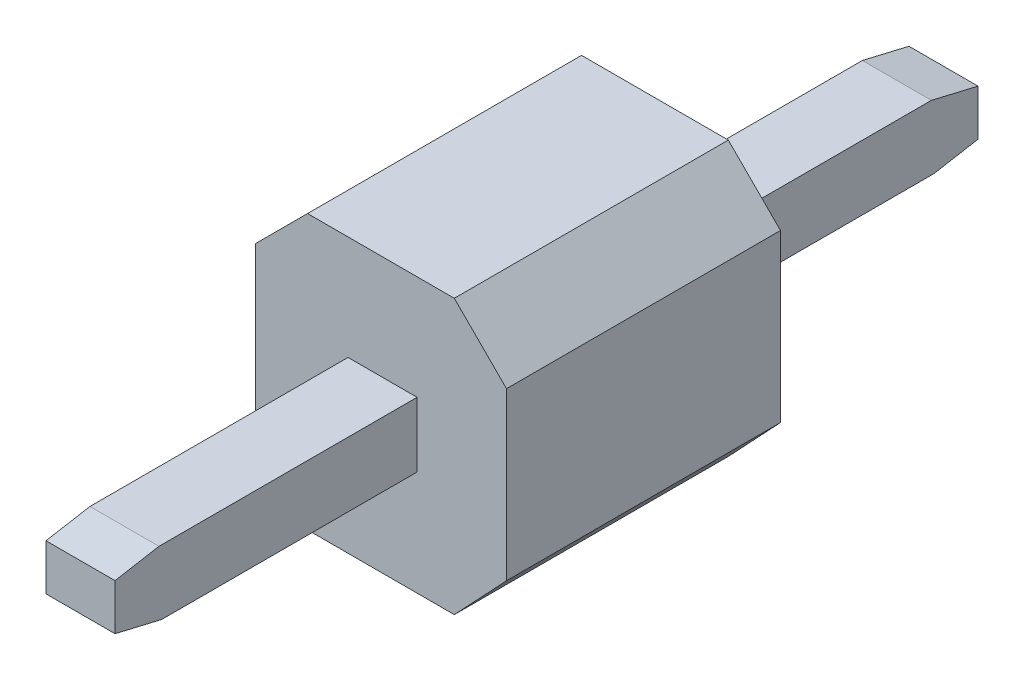
ISO-10303-21;
HEADER;
FILE_DESCRIPTION(('STEP AP214'),'2;1');
FILE_NAME('part.step','',(''),(''),'','','');
FILE_SCHEMA(('AUTOMOTIVE_DESIGN { 1 0 10303 214 1 1 1 1 }'));
ENDSEC;
DATA;
#1=APPLICATION_CONTEXT('core data for automotive mechanical design processes');
#2=APPLICATION_PROTOCOL_DEFINITION('international standard','automotive_design',2000,#1);
#3=PRODUCT_CONTEXT('',#1,'mechanical');
#4=PRODUCT('Part','Part','',(#3));
#5=PRODUCT_RELATED_PRODUCT_CATEGORY('part','',(#4));
#6=PRODUCT_DEFINITION_FORMATION('','',#4);
#7=PRODUCT_DEFINITION_CONTEXT('part definition',#1,'design');
#8=PRODUCT_DEFINITION('design','',#6,#7);
#9=PRODUCT_DEFINITION_SHAPE('','',#8);
#10=(LENGTH_UNIT() NAMED_UNIT(*) SI_UNIT(.MILLI.,.METRE.));
#11=(NAMED_UNIT(*) PLANE_ANGLE_UNIT() SI_UNIT($,.RADIAN.));
#12=(NAMED_UNIT(*) SI_UNIT($,.STERADIAN.) SOLID_ANGLE_UNIT());
#13=UNCERTAINTY_MEASURE_WITH_UNIT(LENGTH_MEASURE(1.E-05),#10,'distance_accuracy_value','');
#14=(GEOMETRIC_REPRESENTATION_CONTEXT(3) GLOBAL_UNCERTAINTY_ASSIGNED_CONTEXT((#13)) GLOBAL_UNIT_ASSIGNED_CONTEXT((#10,
#11,#12)) REPRESENTATION_CONTEXT('',''));
#15=CARTESIAN_POINT('',(0.,0.,0.));
#16=DIRECTION('',(0.,0.,1.));
#17=DIRECTION('',(1.,0.,0.));
#18=AXIS2_PLACEMENT_3D('',#15,#16,#17);
#19=CARTESIAN_POINT('',(0.957607448466312,1.186765593588,-6.2));
#20=DIRECTION('',(0.,-0.984784936297395,-0.17377752801135));
#21=DIRECTION('',(-1.,0.,0.));
#22=AXIS2_PLACEMENT_3D('',#19,#20,#21);
#23=PLANE('',#22);
#24=DIRECTION('',(0.,0.17377752801135,-0.984784936297395));
#25=VECTOR('',#24,1.);
#26=CARTESIAN_POINT('',(0.940000448466309,0.0302182210716873,0.354072));
#27=LINE('',#26,#25);
#28=CARTESIAN_POINT('',(0.940000448466309,1.11489990927489,-5.79274225984129));
#29=VERTEX_POINT('',#28);
#30=CARTESIAN_POINT('',(0.940000448466309,1.186765593588,-6.2));
#31=VERTEX_POINT('',#30);
#32=EDGE_CURVE('E162',#29,#31,#27,.T.);
#33=ORIENTED_EDGE('',*,*,#32,.T.);
#34=DIRECTION('',(1.,0.,0.));
#35=VECTOR('',#34,1.);
#36=CARTESIAN_POINT('',(1.2448931627479,1.186765593588,-6.2));
#37=LINE('',#36,#35);
#38=CARTESIAN_POINT('',(1.58000016274341,1.186765593588,-6.2));
#39=VERTEX_POINT('',#38);
#40=EDGE_CURVE('E12',#31,#39,#37,.T.);
#41=ORIENTED_EDGE('',*,*,#40,.T.);
#42=DIRECTION('',(0.,-0.17377752801135,0.984784936297395));
#43=VECTOR('',#42,1.);
#44=CARTESIAN_POINT('',(1.58000016274341,0.0302182210716873,0.354072));
#45=LINE('',#44,#43);
#46=CARTESIAN_POINT('',(1.58000016274341,1.11489990927489,-5.79274225984129));
#47=VERTEX_POINT('',#46);
#48=EDGE_CURVE('E201',#39,#47,#45,.T.);
#49=ORIENTED_EDGE('',*,*,#48,.T.);
#50=DIRECTION('',(-1.,0.,0.));
#51=VECTOR('',#50,1.);
#52=CARTESIAN_POINT('',(1.2448931627479,1.11489990927489,-5.79274225984129));
#53=LINE('',#52,#51);
#54=EDGE_CURVE('E196',#47,#29,#53,.T.);
#55=ORIENTED_EDGE('',*,*,#54,.T.);
#56=EDGE_LOOP('',(#33,#41,#49,#55));
#57=FACE_BOUND('',#56,.T.);
#58=ADVANCED_FACE('F54',(#57),#23,.T.);
#59=CARTESIAN_POINT('',(1.2448931627479,2.2034713378129,-6.2));
#60=DIRECTION('',(0.,0.,1.));
#61=DIRECTION('',(0.,-1.,0.));
#62=AXIS2_PLACEMENT_3D('',#59,#60,#61);
#63=PLANE('',#62);
#64=DIRECTION('',(-1.,0.,0.));
#65=VECTOR('',#64,1.);
#66=CARTESIAN_POINT('',(1.2448931627479,1.61323393573551,-6.2));
#67=LINE('',#66,#65);
#68=CARTESIAN_POINT('',(1.58000016274341,1.61323393573551,-6.2));
#69=VERTEX_POINT('',#68);
#70=CARTESIAN_POINT('',(0.940000448466309,1.61323393573551,-6.2));
#71=VERTEX_POINT('',#70);
#72=EDGE_CURVE('E65',#69,#71,#67,.T.);
#73=ORIENTED_EDGE('',*,*,#72,.F.);
#74=DIRECTION('',(0.,-1.,0.));
#75=VECTOR('',#74,1.);
#76=CARTESIAN_POINT('',(1.58000016274341,-26.473278661799,-6.2));
#77=LINE('',#76,#75);
#78=EDGE_CURVE('E198',#69,#39,#77,.T.);
#79=ORIENTED_EDGE('',*,*,#78,.T.);
#80=ORIENTED_EDGE('',*,*,#40,.F.);
#81=DIRECTION('',(0.,1.,0.));
#82=VECTOR('',#81,1.);
#83=CARTESIAN_POINT('',(0.940000448466309,-26.473278661799,-6.2));
#84=LINE('',#83,#82);
#85=EDGE_CURVE('E58',#31,#71,#84,.T.);
#86=ORIENTED_EDGE('',*,*,#85,.T.);
#87=EDGE_LOOP('',(#73,#79,#80,#86));
#88=FACE_BOUND('',#87,.T.);
#89=ADVANCED_FACE('F309',(#88),#63,.F.);
#90=CARTESIAN_POINT('',(0.957607448466312,1.71489990926631,-5.76794212488841));
#91=DIRECTION('',(0.,0.973414507556786,-0.229050641732304));
#92=DIRECTION('',(0.,0.229050641732304,0.973414507556786));
#93=AXIS2_PLACEMENT_3D('',#90,#91,#92);
#94=PLANE('',#93);
#95=DIRECTION('',(0.,0.229050641732304,0.973414507556786));
#96=VECTOR('',#95,1.);
#97=CARTESIAN_POINT('',(0.940000448466309,3.155448876961,0.354072));
#98=LINE('',#97,#96);
#99=CARTESIAN_POINT('',(0.940000448466309,1.71489990926631,-5.76794212488841));
#100=VERTEX_POINT('',#99);
#101=EDGE_CURVE('E210',#71,#100,#98,.T.);
#102=ORIENTED_EDGE('',*,*,#101,.T.);
#103=DIRECTION('',(1.,0.,0.));
#104=VECTOR('',#103,1.);
#105=CARTESIAN_POINT('',(1.2448931627479,1.71489990926631,-5.76794212488841));
#106=LINE('',#105,#104);
#107=CARTESIAN_POINT('',(1.58000016274341,1.71489990926631,-5.76794212488841));
#108=VERTEX_POINT('',#107);
#109=EDGE_CURVE('E204',#100,#108,#106,.T.);
#110=ORIENTED_EDGE('',*,*,#109,.T.);
#111=DIRECTION('',(0.,-0.229050641732304,-0.973414507556786));
#112=VECTOR('',#111,1.);
#113=CARTESIAN_POINT('',(1.58000016274341,3.155448876961,0.354072));
#114=LINE('',#113,#112);
#115=EDGE_CURVE('E159',#108,#69,#114,.T.);
#116=ORIENTED_EDGE('',*,*,#115,.T.);
#117=ORIENTED_EDGE('',*,*,#72,.T.);
#118=EDGE_LOOP('',(#102,#110,#116,#117));
#119=FACE_BOUND('',#118,.T.);
#120=ADVANCED_FACE('F299',(#119),#94,.T.);
#121=CARTESIAN_POINT('',(1.58000016274341,1.7196499092663,-0.4095));
#122=DIRECTION('',(-1.,0.,0.));
#123=DIRECTION('',(0.,0.,-1.));
#124=AXIS2_PLACEMENT_3D('',#121,#122,#123);
#125=PLANE('',#124);
#126=DIRECTION('',(0.,0.,-1.));
#127=VECTOR('',#126,1.);
#128=CARTESIAN_POINT('',(1.58000016274341,1.11489990927489,-0.4095));
#129=LINE('',#128,#127);
#130=CARTESIAN_POINT('',(1.58000016274341,1.11489988271578,1.36794212488841));
#131=VERTEX_POINT('',#130);
#132=EDGE_CURVE('E123',#131,#47,#129,.T.);
#133=ORIENTED_EDGE('',*,*,#132,.T.);
#134=ORIENTED_EDGE('',*,*,#48,.F.);
#135=ORIENTED_EDGE('',*,*,#78,.F.);
#136=ORIENTED_EDGE('',*,*,#115,.F.);
#137=DIRECTION('',(0.,0.,-1.));
#138=VECTOR('',#137,1.);
#139=CARTESIAN_POINT('',(1.58000016274341,1.71489990926631,-0.4095));
#140=LINE('',#139,#138);
#141=CARTESIAN_POINT('',(1.58000016274341,1.7148998827072,1.39274225984129));
#142=VERTEX_POINT('',#141);
#143=EDGE_CURVE('E104',#142,#108,#140,.T.);
#144=ORIENTED_EDGE('',*,*,#143,.F.);
#145=DIRECTION('',(0.,0.173777528011357,-0.984784936297394));
#146=VECTOR('',#145,1.);
#147=CARTESIAN_POINT('',(1.58000016274341,2.79958157091045,-4.75407199999999));
#148=LINE('',#147,#146);
#149=CARTESIAN_POINT('',(1.58000016274341,1.64303419839408,1.8));
#150=VERTEX_POINT('',#149);
#151=EDGE_CURVE('E157',#150,#142,#148,.T.);
#152=ORIENTED_EDGE('',*,*,#151,.F.);
#153=DIRECTION('',(0.,1.,0.));
#154=VECTOR('',#153,1.);
#155=CARTESIAN_POINT('',(1.58000016274341,29.3030784537811,1.80000000000019));
#156=LINE('',#155,#154);
#157=CARTESIAN_POINT('',(1.58000016274341,1.21656585624658,1.8));
#158=VERTEX_POINT('',#157);
#159=EDGE_CURVE('E172',#158,#150,#156,.T.);
#160=ORIENTED_EDGE('',*,*,#159,.F.);
#161=DIRECTION('',(0.,0.229050641732297,0.973414507556787));
#162=VECTOR('',#161,1.);
#163=CARTESIAN_POINT('',(1.58000016274341,-0.325649084978862,-4.75407200000001));
#164=LINE('',#163,#162);
#165=EDGE_CURVE('E388',#131,#158,#164,.T.);
#166=ORIENTED_EDGE('',*,*,#165,.F.);
#167=EDGE_LOOP('',(#133,#134,#135,#136,#144,#152,#160,#166));
#168=FACE_BOUND('',#167,.T.);
#169=ADVANCED_FACE('F56',(#168),#125,.F.);
#170=CARTESIAN_POINT('',(0.940000448466309,1.11489990927489,-0.4095));
#171=DIRECTION('',(1.,0.,0.));
#172=DIRECTION('',(0.,-1.,0.));
#173=AXIS2_PLACEMENT_3D('',#170,#171,#172);
#174=PLANE('',#173);
#175=DIRECTION('',(0.,0.,-1.));
#176=VECTOR('',#175,1.);
#177=CARTESIAN_POINT('',(0.940000448466309,1.71489990926631,-0.4095));
#178=LINE('',#177,#176);
#179=CARTESIAN_POINT('',(0.940000448466309,1.7148998827072,1.39274225984129));
#180=VERTEX_POINT('',#179);
#181=EDGE_CURVE('E112',#180,#100,#178,.T.);
#182=ORIENTED_EDGE('',*,*,#181,.T.);
#183=ORIENTED_EDGE('',*,*,#101,.F.);
#184=ORIENTED_EDGE('',*,*,#85,.F.);
#185=ORIENTED_EDGE('',*,*,#32,.F.);
#186=DIRECTION('',(0.,0.,-1.));
#187=VECTOR('',#186,1.);
#188=CARTESIAN_POINT('',(0.940000448466309,1.11489990927489,-0.4095));
#189=LINE('',#188,#187);
#190=CARTESIAN_POINT('',(0.940000448466309,1.11489988271578,1.36794212488841));
#191=VERTEX_POINT('',#190);
#192=EDGE_CURVE('E194',#191,#29,#189,.T.);
#193=ORIENTED_EDGE('',*,*,#192,.F.);
#194=DIRECTION('',(0.,-0.229050641732297,-0.973414507556787));
#195=VECTOR('',#194,1.);
#196=CARTESIAN_POINT('',(0.940000448466309,-0.325649084978862,-4.75407200000001));
#197=LINE('',#196,#195);
#198=CARTESIAN_POINT('',(0.940000448466309,1.21656585624658,1.8));
#199=VERTEX_POINT('',#198);
#200=EDGE_CURVE('E188',#199,#191,#197,.T.);
#201=ORIENTED_EDGE('',*,*,#200,.F.);
#202=DIRECTION('',(0.,-1.,0.));
#203=VECTOR('',#202,1.);
#204=CARTESIAN_POINT('',(0.940000448466309,29.3030784537811,1.80000000000019));
#205=LINE('',#204,#203);
#206=CARTESIAN_POINT('',(0.940000448466309,1.64303419839408,1.8));
#207=VERTEX_POINT('',#206);
#208=EDGE_CURVE('E173',#207,#199,#205,.T.);
#209=ORIENTED_EDGE('',*,*,#208,.F.);
#210=DIRECTION('',(0.,-0.173777528011357,0.984784936297394));
#211=VECTOR('',#210,1.);
#212=CARTESIAN_POINT('',(0.940000448466309,2.79958157091045,-4.75407199999999));
#213=LINE('',#212,#211);
#214=EDGE_CURVE('E184',#180,#207,#213,.T.);
#215=ORIENTED_EDGE('',*,*,#214,.F.);
#216=EDGE_LOOP('',(#182,#183,#184,#185,#193,#201,#209,#215));
#217=FACE_BOUND('',#216,.T.);
#218=ADVANCED_FACE('F231',(#217),#174,.F.);
#219=CARTESIAN_POINT('',(0.957607448466312,1.71489990926631,-0.4095));
#220=DIRECTION('',(0.,-1.,0.));
#221=DIRECTION('',(1.,0.,0.));
#222=AXIS2_PLACEMENT_3D('',#219,#220,#221);
#223=PLANE('',#222);
#224=ORIENTED_EDGE('',*,*,#143,.T.);
#225=ORIENTED_EDGE('',*,*,#109,.F.);
#226=ORIENTED_EDGE('',*,*,#181,.F.);
#227=DIRECTION('',(-1.,0.,0.));
#228=VECTOR('',#227,1.);
#229=CARTESIAN_POINT('',(1.2448931627479,1.7148998827072,1.39274225984129));
#230=LINE('',#229,#228);
#231=EDGE_CURVE('E168',#142,#180,#230,.T.);
#232=ORIENTED_EDGE('',*,*,#231,.F.);
#233=EDGE_LOOP('',(#224,#225,#226,#232));
#234=FACE_BOUND('',#233,.T.);
#235=ADVANCED_FACE('F175',(#234),#223,.F.);
#236=CARTESIAN_POINT('',(1.56239316274341,1.11489990927489,-0.4095));
#237=DIRECTION('',(0.,1.,0.));
#238=DIRECTION('',(0.,0.,1.));
#239=AXIS2_PLACEMENT_3D('',#236,#237,#238);
#240=PLANE('',#239);
#241=ORIENTED_EDGE('',*,*,#192,.T.);
#242=ORIENTED_EDGE('',*,*,#54,.F.);
#243=ORIENTED_EDGE('',*,*,#132,.F.);
#244=DIRECTION('',(1.,0.,0.));
#245=VECTOR('',#244,1.);
#246=CARTESIAN_POINT('',(1.2448931627479,1.11489988271578,1.36794212488841));
#247=LINE('',#246,#245);
#248=EDGE_CURVE('E177',#191,#131,#247,.T.);
#249=ORIENTED_EDGE('',*,*,#248,.F.);
#250=EDGE_LOOP('',(#241,#242,#243,#249));
#251=FACE_BOUND('',#250,.T.);
#252=ADVANCED_FACE('F227',(#251),#240,.F.);
#253=CARTESIAN_POINT('',(0.957607448466312,1.64303419839408,1.8));
#254=DIRECTION('',(0.,0.984784936297394,0.173777528011357));
#255=DIRECTION('',(-1.,0.,0.));
#256=AXIS2_PLACEMENT_3D('',#253,#254,#255);
#257=PLANE('',#256);
#258=ORIENTED_EDGE('',*,*,#214,.T.);
#259=DIRECTION('',(1.,0.,0.));
#260=VECTOR('',#259,1.);
#261=CARTESIAN_POINT('',(1.2448931627479,1.64303419839408,1.8));
#262=LINE('',#261,#260);
#263=EDGE_CURVE('E169',#207,#150,#262,.T.);
#264=ORIENTED_EDGE('',*,*,#263,.T.);
#265=ORIENTED_EDGE('',*,*,#151,.T.);
#266=ORIENTED_EDGE('',*,*,#231,.T.);
#267=EDGE_LOOP('',(#258,#264,#265,#266));
#268=FACE_BOUND('',#267,.T.);
#269=ADVANCED_FACE('F167',(#268),#257,.T.);
#270=CARTESIAN_POINT('',(1.2448931627479,0.626328454169186,1.79999999999999));
#271=DIRECTION('',(0.,0.,-1.));
#272=DIRECTION('',(0.,1.,0.));
#273=AXIS2_PLACEMENT_3D('',#270,#271,#272);
#274=PLANE('',#273);
#275=DIRECTION('',(-1.,0.,0.));
#276=VECTOR('',#275,1.);
#277=CARTESIAN_POINT('',(1.2448931627479,1.21656585624658,1.8));
#278=LINE('',#277,#276);
#279=EDGE_CURVE('E384',#158,#199,#278,.T.);
#280=ORIENTED_EDGE('',*,*,#279,.F.);
#281=ORIENTED_EDGE('',*,*,#159,.T.);
#282=ORIENTED_EDGE('',*,*,#263,.F.);
#283=ORIENTED_EDGE('',*,*,#208,.T.);
#284=EDGE_LOOP('',(#280,#281,#282,#283));
#285=FACE_BOUND('',#284,.T.);
#286=ADVANCED_FACE('F348',(#285),#274,.F.);
#287=CARTESIAN_POINT('',(0.957607448466312,1.11489988271578,1.36794212488841));
#288=DIRECTION('',(0.,-0.973414507556787,0.229050641732297));
#289=DIRECTION('',(0.,-0.229050641732297,-0.973414507556787));
#290=AXIS2_PLACEMENT_3D('',#287,#288,#289);
#291=PLANE('',#290);
#292=ORIENTED_EDGE('',*,*,#200,.T.);
#293=ORIENTED_EDGE('',*,*,#248,.T.);
#294=ORIENTED_EDGE('',*,*,#165,.T.);
#295=ORIENTED_EDGE('',*,*,#279,.T.);
#296=EDGE_LOOP('',(#292,#293,#294,#295));
#297=FACE_BOUND('',#296,.T.);
#298=ADVANCED_FACE('F357',(#297),#291,.T.);
#299=CLOSED_SHELL('',(#58,#89,#120,#169,#218,#235,#252,#269,#286,#298));
#300=MANIFOLD_SOLID_BREP('B2',#299);
#301=CARTESIAN_POINT('',(-13.930553122608,20.864971337567,-1.));
#302=DIRECTION('',(0.,0.,1.));
#303=DIRECTION('',(-1.,0.,0.));
#304=AXIS2_PLACEMENT_3D('',#301,#302,#303);
#305=PLANE('',#304);
#306=DIRECTION('',(0.,-1.,0.));
#307=VECTOR('',#306,1.);
#308=CARTESIAN_POINT('',(2.4090540200178,0.,-1.));
#309=LINE('',#308,#307);
#310=CARTESIAN_POINT('',(2.4090540200178,2.1986856235456,-1.));
#311=VERTEX_POINT('',#310);
#312=CARTESIAN_POINT('',(2.4090540200178,0.6565427664246,-1.));
#313=VERTEX_POINT('',#312);
#314=EDGE_CURVE('E622',#311,#313,#309,.T.);
#315=ORIENTED_EDGE('',*,*,#314,.F.);
#316=DIRECTION('',(0.707106781186548,-0.707106781186548,0.));
#317=VECTOR('',#316,1.);
#318=CARTESIAN_POINT('',(1.9252325914532,2.6825070521102,-1.));
#319=LINE('',#318,#317);
#320=CARTESIAN_POINT('',(1.9252325914532,2.6825070521102,-1.));
#321=VERTEX_POINT('',#320);
#322=EDGE_CURVE('E709',#321,#311,#319,.T.);
#323=ORIENTED_EDGE('',*,*,#322,.F.);
#324=DIRECTION('',(-1.,0.,0.));
#325=VECTOR('',#324,1.);
#326=CARTESIAN_POINT('',(1.9252325914532,2.6825070521102,-1.));
#327=LINE('',#326,#325);
#328=CARTESIAN_POINT('',(0.56451830575821,2.6825070521102,-1.));
#329=VERTEX_POINT('',#328);
#330=EDGE_CURVE('E668',#321,#329,#327,.T.);
#331=ORIENTED_EDGE('',*,*,#330,.T.);
#332=DIRECTION('',(-0.707080681462254,-0.707132879947521,0.));
#333=VECTOR('',#332,1.);
#334=CARTESIAN_POINT('',(0.56451830575821,2.6825070521102,-1.));
#335=LINE('',#334,#333);
#336=CARTESIAN_POINT('',(0.08073259147931,2.1986856235456,-1.));
#337=VERTEX_POINT('',#336);
#338=EDGE_CURVE('E612',#329,#337,#335,.T.);
#339=ORIENTED_EDGE('',*,*,#338,.T.);
#340=DIRECTION('',(0.,-1.,0.));
#341=VECTOR('',#340,1.);
#342=CARTESIAN_POINT('',(0.08073259147931,0.,-1.));
#343=LINE('',#342,#341);
#344=CARTESIAN_POINT('',(0.08073259147931,0.6565427664246,-1.));
#345=VERTEX_POINT('',#344);
#346=EDGE_CURVE('E602',#337,#345,#343,.T.);
#347=ORIENTED_EDGE('',*,*,#346,.T.);
#348=DIRECTION('',(-0.685355229855194,0.728208904717688,0.));
#349=VECTOR('',#348,1.);
#350=CARTESIAN_POINT('',(0.56451830575821,0.142507052146197,-1.));
#351=LINE('',#350,#349);
#352=CARTESIAN_POINT('',(0.56451830575821,0.142507052146197,-1.));
#353=VERTEX_POINT('',#352);
#354=EDGE_CURVE('E618',#353,#345,#351,.T.);
#355=ORIENTED_EDGE('',*,*,#354,.F.);
#356=DIRECTION('',(-1.,0.,0.));
#357=VECTOR('',#356,1.);
#358=CARTESIAN_POINT('',(1.9252325914532,0.142507052146197,-1.));
#359=LINE('',#358,#357);
#360=CARTESIAN_POINT('',(1.9252325914532,0.142507052146197,-1.));
#361=VERTEX_POINT('',#360);
#362=EDGE_CURVE('E660',#361,#353,#359,.T.);
#363=ORIENTED_EDGE('',*,*,#362,.F.);
#364=DIRECTION('',(0.685382058210025,0.728183654227277,0.));
#365=VECTOR('',#364,1.);
#366=CARTESIAN_POINT('',(1.9252325914532,0.142507052146197,-1.));
#367=LINE('',#366,#365);
#368=EDGE_CURVE('E676',#361,#313,#367,.T.);
#369=ORIENTED_EDGE('',*,*,#368,.T.);
#370=EDGE_LOOP('',(#315,#323,#331,#339,#347,#355,#363,#369));
#371=FACE_BOUND('',#370,.T.);
#372=DIRECTION('',(-1.,0.,0.));
#373=VECTOR('',#372,1.);
#374=CARTESIAN_POINT('',(-13.930553122608,1.7148999092667,-1.));
#375=LINE('',#374,#373);
#376=CARTESIAN_POINT('',(1.580000162743,1.7148999092667,-1.));
#377=VERTEX_POINT('',#376);
#378=CARTESIAN_POINT('',(0.9400004484659,1.7148999092667,-1.));
#379=VERTEX_POINT('',#378);
#380=EDGE_CURVE('E562',#377,#379,#375,.T.);
#381=ORIENTED_EDGE('',*,*,#380,.F.);
#382=DIRECTION('',(0.,1.,0.));
#383=VECTOR('',#382,1.);
#384=CARTESIAN_POINT('',(1.580000162743,20.864971337567,-1.));
#385=LINE('',#384,#383);
#386=CARTESIAN_POINT('',(1.580000162743,1.1148999092753,-1.));
#387=VERTEX_POINT('',#386);
#388=EDGE_CURVE('E640',#387,#377,#385,.T.);
#389=ORIENTED_EDGE('',*,*,#388,.F.);
#390=DIRECTION('',(1.,0.,0.));
#391=VECTOR('',#390,1.);
#392=CARTESIAN_POINT('',(-13.930553122608,1.1148999092753,-1.));
#393=LINE('',#392,#391);
#394=CARTESIAN_POINT('',(0.9400004484659,1.1148999092753,-1.));
#395=VERTEX_POINT('',#394);
#396=EDGE_CURVE('E488',#395,#387,#393,.T.);
#397=ORIENTED_EDGE('',*,*,#396,.F.);
#398=DIRECTION('',(0.,-1.,0.));
#399=VECTOR('',#398,1.);
#400=CARTESIAN_POINT('',(0.9400004484659,20.864971337567,-1.));
#401=LINE('',#400,#399);
#402=EDGE_CURVE('E649',#379,#395,#401,.T.);
#403=ORIENTED_EDGE('',*,*,#402,.F.);
#404=EDGE_LOOP('',(#381,#389,#397,#403));
#405=FACE_BOUND('',#404,.T.);
#406=ADVANCED_FACE('F477',(#371,#405),#305,.T.);
#407=CARTESIAN_POINT('',(-13.930553122608,20.864971337567,-3.54));
#408=DIRECTION('',(0.,0.,1.));
#409=DIRECTION('',(-1.,0.,0.));
#410=AXIS2_PLACEMENT_3D('',#407,#408,#409);
#411=PLANE('',#410);
#412=DIRECTION('',(-1.,0.,0.));
#413=VECTOR('',#412,1.);
#414=CARTESIAN_POINT('',(-13.930553122608,1.1148999092753,-3.54));
#415=LINE('',#414,#413);
#416=CARTESIAN_POINT('',(1.580000162743,1.1148999092753,-3.54));
#417=VERTEX_POINT('',#416);
#418=CARTESIAN_POINT('',(0.9400004484659,1.1148999092753,-3.54));
#419=VERTEX_POINT('',#418);
#420=EDGE_CURVE('E52',#417,#419,#415,.T.);
#421=ORIENTED_EDGE('',*,*,#420,.F.);
#422=DIRECTION('',(0.,-1.,0.));
#423=VECTOR('',#422,1.);
#424=CARTESIAN_POINT('',(1.580000162743,20.864971337567,-3.54));
#425=LINE('',#424,#423);
#426=CARTESIAN_POINT('',(1.580000162743,1.7148999092667,-3.54));
#427=VERTEX_POINT('',#426);
#428=EDGE_CURVE('E642',#427,#417,#425,.T.);
#429=ORIENTED_EDGE('',*,*,#428,.F.);
#430=DIRECTION('',(1.,0.,0.));
#431=VECTOR('',#430,1.);
#432=CARTESIAN_POINT('',(-13.930553122608,1.7148999092667,-3.54));
#433=LINE('',#432,#431);
#434=CARTESIAN_POINT('',(0.9400004484659,1.7148999092667,-3.54));
#435=VERTEX_POINT('',#434);
#436=EDGE_CURVE('E667',#435,#427,#433,.T.);
#437=ORIENTED_EDGE('',*,*,#436,.F.);
#438=DIRECTION('',(0.,1.,0.));
#439=VECTOR('',#438,1.);
#440=CARTESIAN_POINT('',(0.9400004484659,20.864971337567,-3.54));
#441=LINE('',#440,#439);
#442=EDGE_CURVE('E648',#419,#435,#441,.T.);
#443=ORIENTED_EDGE('',*,*,#442,.F.);
#444=EDGE_LOOP('',(#421,#429,#437,#443));
#445=FACE_BOUND('',#444,.T.);
#446=DIRECTION('',(0.707106781186548,-0.707106781186548,0.));
#447=VECTOR('',#446,1.);
#448=CARTESIAN_POINT('',(1.9252325914532,2.6825070521102,-3.54));
#449=LINE('',#448,#447);
#450=CARTESIAN_POINT('',(1.9252325914532,2.6825070521102,-3.54));
#451=VERTEX_POINT('',#450);
#452=CARTESIAN_POINT('',(2.4090540200178,2.1986856235456,-3.54));
#453=VERTEX_POINT('',#452);
#454=EDGE_CURVE('E690',#451,#453,#449,.T.);
#455=ORIENTED_EDGE('',*,*,#454,.T.);
#456=DIRECTION('',(0.,-1.,0.));
#457=VECTOR('',#456,1.);
#458=CARTESIAN_POINT('',(2.4090540200178,20.864971337567,-3.54));
#459=LINE('',#458,#457);
#460=CARTESIAN_POINT('',(2.4090540200178,0.656542766424653,-3.54));
#461=VERTEX_POINT('',#460);
#462=EDGE_CURVE('E739',#453,#461,#459,.T.);
#463=ORIENTED_EDGE('',*,*,#462,.T.);
#464=DIRECTION('',(0.685382058210025,0.728183654227277,0.));
#465=VECTOR('',#464,1.);
#466=CARTESIAN_POINT('',(1.9252325914532,0.142507052146197,-3.54));
#467=LINE('',#466,#465);
#468=CARTESIAN_POINT('',(1.9252325914532,0.142507052146197,-3.54));
#469=VERTEX_POINT('',#468);
#470=EDGE_CURVE('E663',#469,#461,#467,.T.);
#471=ORIENTED_EDGE('',*,*,#470,.F.);
#472=DIRECTION('',(-1.,0.,0.));
#473=VECTOR('',#472,1.);
#474=CARTESIAN_POINT('',(1.9252325914532,0.142507052146197,-3.54));
#475=LINE('',#474,#473);
#476=CARTESIAN_POINT('',(0.56451830575821,0.142507052146197,-3.54));
#477=VERTEX_POINT('',#476);
#478=EDGE_CURVE('E628',#469,#477,#475,.T.);
#479=ORIENTED_EDGE('',*,*,#478,.T.);
#480=DIRECTION('',(-0.685355229855194,0.728208904717688,0.));
#481=VECTOR('',#480,1.);
#482=CARTESIAN_POINT('',(0.56451830575821,0.142507052146197,-3.54));
#483=LINE('',#482,#481);
#484=CARTESIAN_POINT('',(0.08073259147931,0.6565427664246,-3.54));
#485=VERTEX_POINT('',#484);
#486=EDGE_CURVE('E611',#477,#485,#483,.T.);
#487=ORIENTED_EDGE('',*,*,#486,.T.);
#488=DIRECTION('',(0.,-1.,0.));
#489=VECTOR('',#488,1.);
#490=CARTESIAN_POINT('',(0.08073259147931,20.864971337567,-3.54));
#491=LINE('',#490,#489);
#492=CARTESIAN_POINT('',(0.08073259147931,2.1986856235456,-3.54));
#493=VERTEX_POINT('',#492);
#494=EDGE_CURVE('E605',#493,#485,#491,.T.);
#495=ORIENTED_EDGE('',*,*,#494,.F.);
#496=DIRECTION('',(-0.707080681462254,-0.707132879947521,0.));
#497=VECTOR('',#496,1.);
#498=CARTESIAN_POINT('',(0.56451830575821,2.6825070521102,-3.54));
#499=LINE('',#498,#497);
#500=CARTESIAN_POINT('',(0.56451830575821,2.6825070521102,-3.54));
#501=VERTEX_POINT('',#500);
#502=EDGE_CURVE('E671',#501,#493,#499,.T.);
#503=ORIENTED_EDGE('',*,*,#502,.F.);
#504=DIRECTION('',(-1.,0.,0.));
#505=VECTOR('',#504,1.);
#506=CARTESIAN_POINT('',(1.9252325914532,2.6825070521102,-3.54));
#507=LINE('',#506,#505);
#508=EDGE_CURVE('E698',#451,#501,#507,.T.);
#509=ORIENTED_EDGE('',*,*,#508,.F.);
#510=EDGE_LOOP('',(#455,#463,#471,#479,#487,#495,#503,#509));
#511=FACE_BOUND('',#510,.T.);
#512=ADVANCED_FACE('F479',(#445,#511),#411,.F.);
#513=CARTESIAN_POINT('',(1.580000162743,1.1148999092753,-1.));
#514=DIRECTION('',(0.,1.,0.));
#515=DIRECTION('',(0.,0.,-1.));
#516=AXIS2_PLACEMENT_3D('',#513,#514,#515);
#517=PLANE('',#516);
#518=ORIENTED_EDGE('',*,*,#396,.T.);
#519=DIRECTION('',(0.,0.,-1.));
#520=VECTOR('',#519,1.);
#521=CARTESIAN_POINT('',(1.580000162743,1.1148999092753,-1.));
#522=LINE('',#521,#520);
#523=EDGE_CURVE('E653',#387,#417,#522,.T.);
#524=ORIENTED_EDGE('',*,*,#523,.T.);
#525=ORIENTED_EDGE('',*,*,#420,.T.);
#526=DIRECTION('',(0.,0.,1.));
#527=VECTOR('',#526,1.);
#528=CARTESIAN_POINT('',(0.9400004484659,1.1148999092753,-1.));
#529=LINE('',#528,#527);
#530=EDGE_CURVE('E645',#419,#395,#529,.T.);
#531=ORIENTED_EDGE('',*,*,#530,.T.);
#532=EDGE_LOOP('',(#518,#524,#525,#531));
#533=FACE_BOUND('',#532,.T.);
#534=ADVANCED_FACE('F772',(#533),#517,.T.);
#535=CARTESIAN_POINT('',(1.580000162743,1.7148999092667,-1.));
#536=DIRECTION('',(-1.,0.,0.));
#537=DIRECTION('',(0.,-1.,0.));
#538=AXIS2_PLACEMENT_3D('',#535,#536,#537);
#539=PLANE('',#538);
#540=ORIENTED_EDGE('',*,*,#388,.T.);
#541=DIRECTION('',(0.,0.,-1.));
#542=VECTOR('',#541,1.);
#543=CARTESIAN_POINT('',(1.580000162743,1.7148999092667,-1.));
#544=LINE('',#543,#542);
#545=EDGE_CURVE('E643',#377,#427,#544,.T.);
#546=ORIENTED_EDGE('',*,*,#545,.T.);
#547=ORIENTED_EDGE('',*,*,#428,.T.);
#548=ORIENTED_EDGE('',*,*,#523,.F.);
#549=EDGE_LOOP('',(#540,#546,#547,#548));
#550=FACE_BOUND('',#549,.T.);
#551=ADVANCED_FACE('F777',(#550),#539,.T.);
#552=CARTESIAN_POINT('',(0.9400004484659,1.7148999092667,-1.));
#553=DIRECTION('',(0.,-1.,0.));
#554=DIRECTION('',(-1.,0.,0.));
#555=AXIS2_PLACEMENT_3D('',#552,#553,#554);
#556=PLANE('',#555);
#557=ORIENTED_EDGE('',*,*,#380,.T.);
#558=DIRECTION('',(0.,0.,-1.));
#559=VECTOR('',#558,1.);
#560=CARTESIAN_POINT('',(0.9400004484659,1.7148999092667,-1.));
#561=LINE('',#560,#559);
#562=EDGE_CURVE('E680',#379,#435,#561,.T.);
#563=ORIENTED_EDGE('',*,*,#562,.T.);
#564=ORIENTED_EDGE('',*,*,#436,.T.);
#565=ORIENTED_EDGE('',*,*,#545,.F.);
#566=EDGE_LOOP('',(#557,#563,#564,#565));
#567=FACE_BOUND('',#566,.T.);
#568=ADVANCED_FACE('F765',(#567),#556,.T.);
#569=CARTESIAN_POINT('',(0.9400004484659,1.1148999092753,-1.));
#570=DIRECTION('',(1.,0.,0.));
#571=DIRECTION('',(0.,0.,1.));
#572=AXIS2_PLACEMENT_3D('',#569,#570,#571);
#573=PLANE('',#572);
#574=ORIENTED_EDGE('',*,*,#402,.T.);
#575=ORIENTED_EDGE('',*,*,#530,.F.);
#576=ORIENTED_EDGE('',*,*,#442,.T.);
#577=ORIENTED_EDGE('',*,*,#562,.F.);
#578=EDGE_LOOP('',(#574,#575,#576,#577));
#579=FACE_BOUND('',#578,.T.);
#580=ADVANCED_FACE('F759',(#579),#573,.T.);
#581=CARTESIAN_POINT('',(2.4090540200178,0.6565427664246,-1.));
#582=DIRECTION('',(-0.728183654227277,0.685382058210025,0.));
#583=DIRECTION('',(0.,0.,-1.));
#584=AXIS2_PLACEMENT_3D('',#581,#582,#583);
#585=PLANE('',#584);
#586=DIRECTION('',(0.,0.,-1.));
#587=VECTOR('',#586,1.);
#588=CARTESIAN_POINT('',(1.9252325914532,0.142507052146197,-1.));
#589=LINE('',#588,#587);
#590=EDGE_CURVE('E634',#361,#469,#589,.T.);
#591=ORIENTED_EDGE('',*,*,#590,.T.);
#592=ORIENTED_EDGE('',*,*,#470,.T.);
#593=DIRECTION('',(0.,0.,-1.));
#594=VECTOR('',#593,1.);
#595=CARTESIAN_POINT('',(2.4090540200178,0.6565427664246,-1.));
#596=LINE('',#595,#594);
#597=EDGE_CURVE('E673',#313,#461,#596,.T.);
#598=ORIENTED_EDGE('',*,*,#597,.F.);
#599=ORIENTED_EDGE('',*,*,#368,.F.);
#600=EDGE_LOOP('',(#591,#592,#598,#599));
#601=FACE_BOUND('',#600,.T.);
#602=ADVANCED_FACE('F764',(#601),#585,.F.);
#603=CARTESIAN_POINT('',(1.9252325914532,0.142507052146197,-1.));
#604=DIRECTION('',(0.,1.,0.));
#605=DIRECTION('',(0.,0.,-1.));
#606=AXIS2_PLACEMENT_3D('',#603,#604,#605);
#607=PLANE('',#606);
#608=DIRECTION('',(0.,0.,-1.));
#609=VECTOR('',#608,1.);
#610=CARTESIAN_POINT('',(0.56451830575821,0.142507052146197,-1.));
#611=LINE('',#610,#609);
#612=EDGE_CURVE('E626',#353,#477,#611,.T.);
#613=ORIENTED_EDGE('',*,*,#612,.T.);
#614=ORIENTED_EDGE('',*,*,#478,.F.);
#615=ORIENTED_EDGE('',*,*,#590,.F.);
#616=ORIENTED_EDGE('',*,*,#362,.T.);
#617=EDGE_LOOP('',(#613,#614,#615,#616));
#618=FACE_BOUND('',#617,.T.);
#619=ADVANCED_FACE('F793',(#618),#607,.F.);
#620=CARTESIAN_POINT('',(0.56451830575821,0.142507052146197,-1.));
#621=DIRECTION('',(0.728208904717688,0.685355229855194,0.));
#622=DIRECTION('',(0.685355229855194,-0.728208904717688,0.));
#623=AXIS2_PLACEMENT_3D('',#620,#621,#622);
#624=PLANE('',#623);
#625=DIRECTION('',(0.,0.,-1.));
#626=VECTOR('',#625,1.);
#627=CARTESIAN_POINT('',(0.08073259147931,0.6565427664246,-1.));
#628=LINE('',#627,#626);
#629=EDGE_CURVE('E599',#345,#485,#628,.T.);
#630=ORIENTED_EDGE('',*,*,#629,.T.);
#631=ORIENTED_EDGE('',*,*,#486,.F.);
#632=ORIENTED_EDGE('',*,*,#612,.F.);
#633=ORIENTED_EDGE('',*,*,#354,.T.);
#634=EDGE_LOOP('',(#630,#631,#632,#633));
#635=FACE_BOUND('',#634,.T.);
#636=ADVANCED_FACE('F624',(#635),#624,.F.);
#637=CARTESIAN_POINT('',(0.08073259147931,2.1986856235456,-1.));
#638=DIRECTION('',(0.707132879947521,-0.707080681462254,0.));
#639=DIRECTION('',(0.,0.,1.));
#640=AXIS2_PLACEMENT_3D('',#637,#638,#639);
#641=PLANE('',#640);
#642=DIRECTION('',(0.,0.,-1.));
#643=VECTOR('',#642,1.);
#644=CARTESIAN_POINT('',(0.56451830575821,2.6825070521102,-1.));
#645=LINE('',#644,#643);
#646=EDGE_CURVE('E672',#329,#501,#645,.T.);
#647=ORIENTED_EDGE('',*,*,#646,.T.);
#648=ORIENTED_EDGE('',*,*,#502,.T.);
#649=DIRECTION('',(0.,0.,-1.));
#650=VECTOR('',#649,1.);
#651=CARTESIAN_POINT('',(0.08073259147931,2.1986856235456,-1.));
#652=LINE('',#651,#650);
#653=EDGE_CURVE('E652',#337,#493,#652,.T.);
#654=ORIENTED_EDGE('',*,*,#653,.F.);
#655=ORIENTED_EDGE('',*,*,#338,.F.);
#656=EDGE_LOOP('',(#647,#648,#654,#655));
#657=FACE_BOUND('',#656,.T.);
#658=ADVANCED_FACE('F741',(#657),#641,.F.);
#659=CARTESIAN_POINT('',(0.56451830575821,2.6825070521102,-1.));
#660=DIRECTION('',(0.,-1.,0.));
#661=DIRECTION('',(-1.,0.,0.));
#662=AXIS2_PLACEMENT_3D('',#659,#660,#661);
#663=PLANE('',#662);
#664=DIRECTION('',(0.,0.,-1.));
#665=VECTOR('',#664,1.);
#666=CARTESIAN_POINT('',(1.9252325914532,2.6825070521102,-1.));
#667=LINE('',#666,#665);
#668=EDGE_CURVE('E694',#321,#451,#667,.T.);
#669=ORIENTED_EDGE('',*,*,#668,.T.);
#670=ORIENTED_EDGE('',*,*,#508,.T.);
#671=ORIENTED_EDGE('',*,*,#646,.F.);
#672=ORIENTED_EDGE('',*,*,#330,.F.);
#673=EDGE_LOOP('',(#669,#670,#671,#672));
#674=FACE_BOUND('',#673,.T.);
#675=ADVANCED_FACE('F730',(#674),#663,.F.);
#676=CARTESIAN_POINT('',(1.9252325914532,2.6825070521102,-1.));
#677=DIRECTION('',(-0.707106781186548,-0.707106781186548,0.));
#678=DIRECTION('',(0.,0.,-1.));
#679=AXIS2_PLACEMENT_3D('',#676,#677,#678);
#680=PLANE('',#679);
#681=DIRECTION('',(0.,0.,-1.));
#682=VECTOR('',#681,1.);
#683=CARTESIAN_POINT('',(2.4090540200178,2.1986856235456,-1.));
#684=LINE('',#683,#682);
#685=EDGE_CURVE('E481',#311,#453,#684,.T.);
#686=ORIENTED_EDGE('',*,*,#685,.T.);
#687=ORIENTED_EDGE('',*,*,#454,.F.);
#688=ORIENTED_EDGE('',*,*,#668,.F.);
#689=ORIENTED_EDGE('',*,*,#322,.T.);
#690=EDGE_LOOP('',(#686,#687,#688,#689));
#691=FACE_BOUND('',#690,.T.);
#692=ADVANCED_FACE('F736',(#691),#680,.F.);
#693=CARTESIAN_POINT('',(2.4090540200178,0.,-11.));
#694=DIRECTION('',(-1.,0.,0.));
#695=DIRECTION('',(0.,0.,1.));
#696=AXIS2_PLACEMENT_3D('',#693,#694,#695);
#697=PLANE('',#696);
#698=ORIENTED_EDGE('',*,*,#462,.F.);
#699=ORIENTED_EDGE('',*,*,#685,.F.);
#700=ORIENTED_EDGE('',*,*,#314,.T.);
#701=ORIENTED_EDGE('',*,*,#597,.T.);
#702=EDGE_LOOP('',(#698,#699,#700,#701));
#703=FACE_BOUND('',#702,.T.);
#704=ADVANCED_FACE('F786',(#703),#697,.F.);
#705=CARTESIAN_POINT('',(0.08073259147931,0.,-11.));
#706=DIRECTION('',(-1.,0.,0.));
#707=DIRECTION('',(0.,0.,1.));
#708=AXIS2_PLACEMENT_3D('',#705,#706,#707);
#709=PLANE('',#708);
#710=ORIENTED_EDGE('',*,*,#629,.F.);
#711=ORIENTED_EDGE('',*,*,#346,.F.);
#712=ORIENTED_EDGE('',*,*,#653,.T.);
#713=ORIENTED_EDGE('',*,*,#494,.T.);
#714=EDGE_LOOP('',(#710,#711,#712,#713));
#715=FACE_BOUND('',#714,.T.);
#716=ADVANCED_FACE('F601',(#715),#709,.T.);
#717=CLOSED_SHELL('',(#406,#512,#534,#551,#568,#580,#602,#619,#636,#658,#675,#692,#704,#716));
#718=MANIFOLD_SOLID_BREP('B6',#717);
#719=ADVANCED_BREP_SHAPE_REPRESENTATION('',(#18,#300,#718),#14);
#720=SHAPE_DEFINITION_REPRESENTATION(#9,#719);
ENDSEC;
END-ISO-10303-21;
